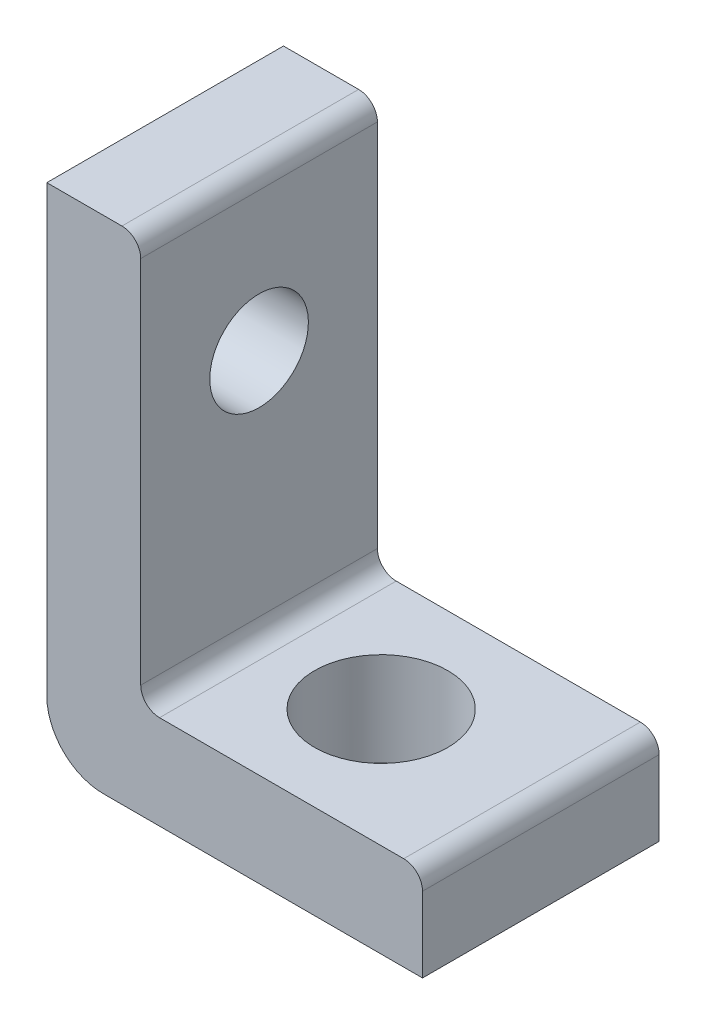
ISO-10303-21;
HEADER;
FILE_DESCRIPTION(('STEP AP214'),'2;1');
FILE_NAME('part.step','',(''),(''),'','','');
FILE_SCHEMA(('AUTOMOTIVE_DESIGN { 1 0 10303 214 1 1 1 1 }'));
ENDSEC;
DATA;
#1=APPLICATION_CONTEXT('core data for automotive mechanical design processes');
#2=APPLICATION_PROTOCOL_DEFINITION('international standard','automotive_design',2000,#1);
#3=PRODUCT_CONTEXT('',#1,'mechanical');
#4=PRODUCT('Part','Part','',(#3));
#5=PRODUCT_RELATED_PRODUCT_CATEGORY('part','',(#4));
#6=PRODUCT_DEFINITION_FORMATION('','',#4);
#7=PRODUCT_DEFINITION_CONTEXT('part definition',#1,'design');
#8=PRODUCT_DEFINITION('design','',#6,#7);
#9=PRODUCT_DEFINITION_SHAPE('','',#8);
#10=(LENGTH_UNIT() NAMED_UNIT(*) SI_UNIT(.MILLI.,.METRE.));
#11=(NAMED_UNIT(*) PLANE_ANGLE_UNIT() SI_UNIT($,.RADIAN.));
#12=(NAMED_UNIT(*) SI_UNIT($,.STERADIAN.) SOLID_ANGLE_UNIT());
#13=UNCERTAINTY_MEASURE_WITH_UNIT(LENGTH_MEASURE(1.E-05),#10,'distance_accuracy_value','');
#14=(GEOMETRIC_REPRESENTATION_CONTEXT(3) GLOBAL_UNCERTAINTY_ASSIGNED_CONTEXT((#13)) GLOBAL_UNIT_ASSIGNED_CONTEXT((#10,
#11,#12)) REPRESENTATION_CONTEXT('',''));
#15=CARTESIAN_POINT('',(0.,0.,0.));
#16=DIRECTION('',(0.,0.,1.));
#17=DIRECTION('',(1.,0.,0.));
#18=AXIS2_PLACEMENT_3D('',#15,#16,#17);
#19=CARTESIAN_POINT('',(4.7625,4.7625,6.));
#20=DIRECTION('',(-1.,0.,0.));
#21=DIRECTION('',(0.,-1.,0.));
#22=AXIS2_PLACEMENT_3D('',#19,#20,#21);
#23=PLANE('',#22);
#24=CARTESIAN_POINT('',(4.7625,17.4,0.));
#25=DIRECTION('',(-1.,0.,0.));
#26=DIRECTION('',(0.,-1.,0.));
#27=AXIS2_PLACEMENT_3D('',#24,#25,#26);
#28=CIRCLE('',#27,2.5);
#29=CARTESIAN_POINT('',(4.7625,14.9,0.));
#30=VERTEX_POINT('',#29);
#31=EDGE_CURVE('E225',#30,#30,#28,.F.);
#32=ORIENTED_EDGE('',*,*,#31,.F.);
#33=EDGE_LOOP('',(#32));
#34=FACE_BOUND('',#33,.T.);
#35=DIRECTION('',(0.,1.,0.));
#36=VECTOR('',#35,1.);
#37=CARTESIAN_POINT('',(4.7625,4.7625,-6.));
#38=LINE('',#37,#36);
#39=CARTESIAN_POINT('',(4.7625,5.715,-6.));
#40=VERTEX_POINT('',#39);
#41=CARTESIAN_POINT('',(4.7625,24.4475,-6.));
#42=VERTEX_POINT('',#41);
#43=EDGE_CURVE('E146',#40,#42,#38,.T.);
#44=ORIENTED_EDGE('',*,*,#43,.T.);
#45=DIRECTION('',(0.,0.,-1.));
#46=VECTOR('',#45,1.);
#47=CARTESIAN_POINT('',(4.7625,24.4475,6.));
#48=LINE('',#47,#46);
#49=CARTESIAN_POINT('',(4.7625,24.4475,6.));
#50=VERTEX_POINT('',#49);
#51=EDGE_CURVE('E181',#42,#50,#48,.F.);
#52=ORIENTED_EDGE('',*,*,#51,.T.);
#53=DIRECTION('',(0.,1.,0.));
#54=VECTOR('',#53,1.);
#55=CARTESIAN_POINT('',(4.7625,4.7625,6.));
#56=LINE('',#55,#54);
#57=CARTESIAN_POINT('',(4.7625,5.715,6.));
#58=VERTEX_POINT('',#57);
#59=EDGE_CURVE('E124',#58,#50,#56,.T.);
#60=ORIENTED_EDGE('',*,*,#59,.F.);
#61=DIRECTION('',(0.,0.,-1.));
#62=VECTOR('',#61,1.);
#63=CARTESIAN_POINT('',(4.7625,5.715,-6.));
#64=LINE('',#63,#62);
#65=EDGE_CURVE('E178',#58,#40,#64,.T.);
#66=ORIENTED_EDGE('',*,*,#65,.T.);
#67=EDGE_LOOP('',(#44,#52,#60,#66));
#68=FACE_BOUND('',#67,.T.);
#69=ADVANCED_FACE('F37',(#34,#68),#23,.F.);
#70=CARTESIAN_POINT('',(4.7625,25.4,6.));
#71=DIRECTION('',(0.,-1.,0.));
#72=DIRECTION('',(0.,0.,-1.));
#73=AXIS2_PLACEMENT_3D('',#70,#71,#72);
#74=PLANE('',#73);
#75=DIRECTION('',(-1.,0.,0.));
#76=VECTOR('',#75,1.);
#77=CARTESIAN_POINT('',(4.7625,25.4,6.));
#78=LINE('',#77,#76);
#79=CARTESIAN_POINT('',(3.81,25.4,6.));
#80=VERTEX_POINT('',#79);
#81=CARTESIAN_POINT('',(0.,25.4,6.));
#82=VERTEX_POINT('',#81);
#83=EDGE_CURVE('E113',#80,#82,#78,.T.);
#84=ORIENTED_EDGE('',*,*,#83,.F.);
#85=DIRECTION('',(0.,0.,-1.));
#86=VECTOR('',#85,1.);
#87=CARTESIAN_POINT('',(3.81,25.4,6.));
#88=LINE('',#87,#86);
#89=CARTESIAN_POINT('',(3.81,25.4,-6.));
#90=VERTEX_POINT('',#89);
#91=EDGE_CURVE('E176',#80,#90,#88,.T.);
#92=ORIENTED_EDGE('',*,*,#91,.T.);
#93=DIRECTION('',(-1.,0.,0.));
#94=VECTOR('',#93,1.);
#95=CARTESIAN_POINT('',(4.7625,25.4,-6.));
#96=LINE('',#95,#94);
#97=CARTESIAN_POINT('',(0.,25.4,-6.));
#98=VERTEX_POINT('',#97);
#99=EDGE_CURVE('E130',#90,#98,#96,.T.);
#100=ORIENTED_EDGE('',*,*,#99,.T.);
#101=DIRECTION('',(0.,0.,-1.));
#102=VECTOR('',#101,1.);
#103=CARTESIAN_POINT('',(0.,25.4,6.));
#104=LINE('',#103,#102);
#105=EDGE_CURVE('E127',#82,#98,#104,.T.);
#106=ORIENTED_EDGE('',*,*,#105,.F.);
#107=EDGE_LOOP('',(#84,#92,#100,#106));
#108=FACE_BOUND('',#107,.T.);
#109=ADVANCED_FACE('F128',(#108),#74,.F.);
#110=CARTESIAN_POINT('',(0.,25.4,6.));
#111=DIRECTION('',(1.,0.,0.));
#112=DIRECTION('',(0.,1.,0.));
#113=AXIS2_PLACEMENT_3D('',#110,#111,#112);
#114=PLANE('',#113);
#115=CARTESIAN_POINT('',(0.,17.4,0.));
#116=DIRECTION('',(-1.,0.,0.));
#117=DIRECTION('',(0.,-1.,0.));
#118=AXIS2_PLACEMENT_3D('',#115,#116,#117);
#119=CIRCLE('',#118,2.5);
#120=CARTESIAN_POINT('',(0.,14.9,0.));
#121=VERTEX_POINT('',#120);
#122=EDGE_CURVE('E228',#121,#121,#119,.T.);
#123=ORIENTED_EDGE('',*,*,#122,.F.);
#124=EDGE_LOOP('',(#123));
#125=FACE_BOUND('',#124,.T.);
#126=DIRECTION('',(0.,-1.,0.));
#127=VECTOR('',#126,1.);
#128=CARTESIAN_POINT('',(0.,25.4,-6.));
#129=LINE('',#128,#127);
#130=CARTESIAN_POINT('',(0.,2.8575,-6.));
#131=VERTEX_POINT('',#130);
#132=EDGE_CURVE('E151',#98,#131,#129,.T.);
#133=ORIENTED_EDGE('',*,*,#132,.T.);
#134=DIRECTION('',(0.,0.,-1.));
#135=VECTOR('',#134,1.);
#136=CARTESIAN_POINT('',(0.,2.8575,6.));
#137=LINE('',#136,#135);
#138=CARTESIAN_POINT('',(0.,2.8575,6.));
#139=VERTEX_POINT('',#138);
#140=EDGE_CURVE('E45',#131,#139,#137,.F.);
#141=ORIENTED_EDGE('',*,*,#140,.T.);
#142=DIRECTION('',(0.,-1.,0.));
#143=VECTOR('',#142,1.);
#144=CARTESIAN_POINT('',(0.,25.4,6.));
#145=LINE('',#144,#143);
#146=EDGE_CURVE('E116',#82,#139,#145,.T.);
#147=ORIENTED_EDGE('',*,*,#146,.F.);
#148=ORIENTED_EDGE('',*,*,#105,.T.);
#149=EDGE_LOOP('',(#133,#141,#147,#148));
#150=FACE_BOUND('',#149,.T.);
#151=ADVANCED_FACE('F134',(#125,#150),#114,.F.);
#152=CARTESIAN_POINT('',(0.,0.,6.));
#153=DIRECTION('',(0.,1.,0.));
#154=DIRECTION('',(0.,0.,1.));
#155=AXIS2_PLACEMENT_3D('',#152,#153,#154);
#156=PLANE('',#155);
#157=CARTESIAN_POINT('',(10.95375,0.,0.));
#158=DIRECTION('',(0.,-1.,0.));
#159=DIRECTION('',(0.,0.,-1.));
#160=AXIS2_PLACEMENT_3D('',#157,#158,#159);
#161=CIRCLE('',#160,3.37819999999999);
#162=CARTESIAN_POINT('',(10.95375,0.,-3.37819999999999));
#163=VERTEX_POINT('',#162);
#164=EDGE_CURVE('E222',#163,#163,#161,.T.);
#165=ORIENTED_EDGE('',*,*,#164,.F.);
#166=EDGE_LOOP('',(#165));
#167=FACE_BOUND('',#166,.T.);
#168=DIRECTION('',(1.,0.,0.));
#169=VECTOR('',#168,1.);
#170=CARTESIAN_POINT('',(0.,0.,6.));
#171=LINE('',#170,#169);
#172=CARTESIAN_POINT('',(2.8575,0.,6.));
#173=VERTEX_POINT('',#172);
#174=CARTESIAN_POINT('',(19.05,0.,6.));
#175=VERTEX_POINT('',#174);
#176=EDGE_CURVE('E135',#173,#175,#171,.T.);
#177=ORIENTED_EDGE('',*,*,#176,.F.);
#178=DIRECTION('',(0.,0.,-1.));
#179=VECTOR('',#178,1.);
#180=CARTESIAN_POINT('',(2.8575,0.,6.));
#181=LINE('',#180,#179);
#182=CARTESIAN_POINT('',(2.8575,0.,-6.));
#183=VERTEX_POINT('',#182);
#184=EDGE_CURVE('E187',#173,#183,#181,.T.);
#185=ORIENTED_EDGE('',*,*,#184,.T.);
#186=DIRECTION('',(1.,0.,0.));
#187=VECTOR('',#186,1.);
#188=CARTESIAN_POINT('',(0.,0.,-6.));
#189=LINE('',#188,#187);
#190=CARTESIAN_POINT('',(19.05,0.,-6.));
#191=VERTEX_POINT('',#190);
#192=EDGE_CURVE('E153',#183,#191,#189,.T.);
#193=ORIENTED_EDGE('',*,*,#192,.T.);
#194=DIRECTION('',(0.,0.,-1.));
#195=VECTOR('',#194,1.);
#196=CARTESIAN_POINT('',(19.05,0.,6.));
#197=LINE('',#196,#195);
#198=EDGE_CURVE('E132',#175,#191,#197,.T.);
#199=ORIENTED_EDGE('',*,*,#198,.F.);
#200=EDGE_LOOP('',(#177,#185,#193,#199));
#201=FACE_BOUND('',#200,.T.);
#202=ADVANCED_FACE('F193',(#167,#201),#156,.F.);
#203=CARTESIAN_POINT('',(19.05,0.,6.));
#204=DIRECTION('',(-1.,0.,0.));
#205=DIRECTION('',(0.,0.,1.));
#206=AXIS2_PLACEMENT_3D('',#203,#204,#205);
#207=PLANE('',#206);
#208=DIRECTION('',(0.,1.,0.));
#209=VECTOR('',#208,1.);
#210=CARTESIAN_POINT('',(19.05,0.,-6.));
#211=LINE('',#210,#209);
#212=CARTESIAN_POINT('',(19.05,3.81,-6.));
#213=VERTEX_POINT('',#212);
#214=EDGE_CURVE('E155',#191,#213,#211,.T.);
#215=ORIENTED_EDGE('',*,*,#214,.T.);
#216=DIRECTION('',(0.,0.,-1.));
#217=VECTOR('',#216,1.);
#218=CARTESIAN_POINT('',(19.05,3.81,6.));
#219=LINE('',#218,#217);
#220=CARTESIAN_POINT('',(19.05,3.81,6.));
#221=VERTEX_POINT('',#220);
#222=EDGE_CURVE('E171',#213,#221,#219,.F.);
#223=ORIENTED_EDGE('',*,*,#222,.T.);
#224=DIRECTION('',(0.,1.,0.));
#225=VECTOR('',#224,1.);
#226=CARTESIAN_POINT('',(19.05,0.,6.));
#227=LINE('',#226,#225);
#228=EDGE_CURVE('E137',#175,#221,#227,.T.);
#229=ORIENTED_EDGE('',*,*,#228,.F.);
#230=ORIENTED_EDGE('',*,*,#198,.T.);
#231=EDGE_LOOP('',(#215,#223,#229,#230));
#232=FACE_BOUND('',#231,.T.);
#233=ADVANCED_FACE('F201',(#232),#207,.F.);
#234=CARTESIAN_POINT('',(19.05,4.7625,6.));
#235=DIRECTION('',(0.,-1.,0.));
#236=DIRECTION('',(1.,0.,0.));
#237=AXIS2_PLACEMENT_3D('',#234,#235,#236);
#238=PLANE('',#237);
#239=CARTESIAN_POINT('',(10.95375,4.7625,0.));
#240=DIRECTION('',(0.,-1.,0.));
#241=DIRECTION('',(1.,0.,0.));
#242=AXIS2_PLACEMENT_3D('',#239,#240,#241);
#243=CIRCLE('',#242,3.37819999999999);
#244=CARTESIAN_POINT('',(14.33195,4.7625,0.));
#245=VERTEX_POINT('',#244);
#246=EDGE_CURVE('E149',#245,#245,#243,.T.);
#247=ORIENTED_EDGE('',*,*,#246,.T.);
#248=EDGE_LOOP('',(#247));
#249=FACE_BOUND('',#248,.T.);
#250=DIRECTION('',(-1.,0.,0.));
#251=VECTOR('',#250,1.);
#252=CARTESIAN_POINT('',(19.05,4.7625,6.));
#253=LINE('',#252,#251);
#254=CARTESIAN_POINT('',(18.0975,4.7625,6.));
#255=VERTEX_POINT('',#254);
#256=CARTESIAN_POINT('',(5.715,4.7625,6.));
#257=VERTEX_POINT('',#256);
#258=EDGE_CURVE('E143',#255,#257,#253,.T.);
#259=ORIENTED_EDGE('',*,*,#258,.F.);
#260=DIRECTION('',(0.,0.,-1.));
#261=VECTOR('',#260,1.);
#262=CARTESIAN_POINT('',(18.0975,4.7625,6.));
#263=LINE('',#262,#261);
#264=CARTESIAN_POINT('',(18.0975,4.7625,-6.));
#265=VERTEX_POINT('',#264);
#266=EDGE_CURVE('E164',#255,#265,#263,.T.);
#267=ORIENTED_EDGE('',*,*,#266,.T.);
#268=DIRECTION('',(-1.,0.,0.));
#269=VECTOR('',#268,1.);
#270=CARTESIAN_POINT('',(19.05,4.7625,-6.));
#271=LINE('',#270,#269);
#272=CARTESIAN_POINT('',(5.715,4.7625,-6.));
#273=VERTEX_POINT('',#272);
#274=EDGE_CURVE('E158',#265,#273,#271,.T.);
#275=ORIENTED_EDGE('',*,*,#274,.T.);
#276=DIRECTION('',(0.,0.,-1.));
#277=VECTOR('',#276,1.);
#278=CARTESIAN_POINT('',(5.715,4.7625,6.));
#279=LINE('',#278,#277);
#280=EDGE_CURVE('E131',#273,#257,#279,.F.);
#281=ORIENTED_EDGE('',*,*,#280,.T.);
#282=EDGE_LOOP('',(#259,#267,#275,#281));
#283=FACE_BOUND('',#282,.T.);
#284=ADVANCED_FACE('F210',(#249,#283),#238,.F.);
#285=CARTESIAN_POINT('',(0.,0.,6.));
#286=DIRECTION('',(0.,0.,1.));
#287=DIRECTION('',(1.,0.,0.));
#288=AXIS2_PLACEMENT_3D('',#285,#286,#287);
#289=PLANE('',#288);
#290=ORIENTED_EDGE('',*,*,#146,.T.);
#291=CARTESIAN_POINT('',(2.8575,2.8575,6.));
#292=DIRECTION('',(0.,0.,1.));
#293=DIRECTION('',(1.,0.,0.));
#294=AXIS2_PLACEMENT_3D('',#291,#292,#293);
#295=CIRCLE('',#294,2.8575);
#296=EDGE_CURVE('E11',#139,#173,#295,.T.);
#297=ORIENTED_EDGE('',*,*,#296,.T.);
#298=ORIENTED_EDGE('',*,*,#176,.T.);
#299=ORIENTED_EDGE('',*,*,#228,.T.);
#300=CARTESIAN_POINT('',(18.0975,3.81,6.));
#301=DIRECTION('',(0.,0.,1.));
#302=DIRECTION('',(1.,0.,0.));
#303=AXIS2_PLACEMENT_3D('',#300,#301,#302);
#304=CIRCLE('',#303,0.9525);
#305=EDGE_CURVE('E174',#221,#255,#304,.T.);
#306=ORIENTED_EDGE('',*,*,#305,.T.);
#307=ORIENTED_EDGE('',*,*,#258,.T.);
#308=CARTESIAN_POINT('',(5.715,5.715,6.));
#309=DIRECTION('',(0.,0.,1.));
#310=DIRECTION('',(1.,0.,0.));
#311=AXIS2_PLACEMENT_3D('',#308,#309,#310);
#312=CIRCLE('',#311,0.9525);
#313=EDGE_CURVE('E185',#257,#58,#312,.F.);
#314=ORIENTED_EDGE('',*,*,#313,.T.);
#315=ORIENTED_EDGE('',*,*,#59,.T.);
#316=CARTESIAN_POINT('',(3.81,24.4475,6.));
#317=DIRECTION('',(0.,0.,1.));
#318=DIRECTION('',(1.,0.,0.));
#319=AXIS2_PLACEMENT_3D('',#316,#317,#318);
#320=CIRCLE('',#319,0.9525);
#321=EDGE_CURVE('E120',#50,#80,#320,.T.);
#322=ORIENTED_EDGE('',*,*,#321,.T.);
#323=ORIENTED_EDGE('',*,*,#83,.T.);
#324=EDGE_LOOP('',(#290,#297,#298,#299,#306,#307,#314,#315,#322,#323));
#325=FACE_BOUND('',#324,.T.);
#326=ADVANCED_FACE('F115',(#325),#289,.T.);
#327=CARTESIAN_POINT('',(0.,0.,-6.));
#328=DIRECTION('',(0.,0.,1.));
#329=DIRECTION('',(1.,0.,0.));
#330=AXIS2_PLACEMENT_3D('',#327,#328,#329);
#331=PLANE('',#330);
#332=ORIENTED_EDGE('',*,*,#192,.F.);
#333=CARTESIAN_POINT('',(2.8575,2.8575,-6.));
#334=DIRECTION('',(0.,0.,1.));
#335=DIRECTION('',(1.,0.,0.));
#336=AXIS2_PLACEMENT_3D('',#333,#334,#335);
#337=CIRCLE('',#336,2.8575);
#338=EDGE_CURVE('E59',#183,#131,#337,.F.);
#339=ORIENTED_EDGE('',*,*,#338,.T.);
#340=ORIENTED_EDGE('',*,*,#132,.F.);
#341=ORIENTED_EDGE('',*,*,#99,.F.);
#342=CARTESIAN_POINT('',(3.81,24.4475,-6.));
#343=DIRECTION('',(0.,0.,1.));
#344=DIRECTION('',(1.,0.,0.));
#345=AXIS2_PLACEMENT_3D('',#342,#343,#344);
#346=CIRCLE('',#345,0.9525);
#347=EDGE_CURVE('E167',#90,#42,#346,.F.);
#348=ORIENTED_EDGE('',*,*,#347,.T.);
#349=ORIENTED_EDGE('',*,*,#43,.F.);
#350=CARTESIAN_POINT('',(5.715,5.715,-6.));
#351=DIRECTION('',(0.,0.,1.));
#352=DIRECTION('',(1.,0.,0.));
#353=AXIS2_PLACEMENT_3D('',#350,#351,#352);
#354=CIRCLE('',#353,0.9525);
#355=EDGE_CURVE('E183',#40,#273,#354,.T.);
#356=ORIENTED_EDGE('',*,*,#355,.T.);
#357=ORIENTED_EDGE('',*,*,#274,.F.);
#358=CARTESIAN_POINT('',(18.0975,3.81,-6.));
#359=DIRECTION('',(0.,0.,1.));
#360=DIRECTION('',(1.,0.,0.));
#361=AXIS2_PLACEMENT_3D('',#358,#359,#360);
#362=CIRCLE('',#361,0.9525);
#363=EDGE_CURVE('E169',#265,#213,#362,.F.);
#364=ORIENTED_EDGE('',*,*,#363,.T.);
#365=ORIENTED_EDGE('',*,*,#214,.F.);
#366=EDGE_LOOP('',(#332,#339,#340,#341,#348,#349,#356,#357,#364,#365));
#367=FACE_BOUND('',#366,.T.);
#368=ADVANCED_FACE('F197',(#367),#331,.F.);
#369=CARTESIAN_POINT('',(18.0975,3.81,6.));
#370=DIRECTION('',(0.,0.,-1.));
#371=DIRECTION('',(-1.,0.,0.));
#372=AXIS2_PLACEMENT_3D('',#369,#370,#371);
#373=CYLINDRICAL_SURFACE('',#372,0.9525);
#374=ORIENTED_EDGE('',*,*,#305,.F.);
#375=ORIENTED_EDGE('',*,*,#222,.F.);
#376=ORIENTED_EDGE('',*,*,#363,.F.);
#377=ORIENTED_EDGE('',*,*,#266,.F.);
#378=EDGE_LOOP('',(#374,#375,#376,#377));
#379=FACE_BOUND('',#378,.T.);
#380=ADVANCED_FACE('F205',(#379),#373,.T.);
#381=CARTESIAN_POINT('',(3.81,24.4475,6.));
#382=DIRECTION('',(0.,0.,-1.));
#383=DIRECTION('',(-1.,0.,0.));
#384=AXIS2_PLACEMENT_3D('',#381,#382,#383);
#385=CYLINDRICAL_SURFACE('',#384,0.9525);
#386=ORIENTED_EDGE('',*,*,#321,.F.);
#387=ORIENTED_EDGE('',*,*,#51,.F.);
#388=ORIENTED_EDGE('',*,*,#347,.F.);
#389=ORIENTED_EDGE('',*,*,#91,.F.);
#390=EDGE_LOOP('',(#386,#387,#388,#389));
#391=FACE_BOUND('',#390,.T.);
#392=ADVANCED_FACE('F255',(#391),#385,.T.);
#393=CARTESIAN_POINT('',(5.715,5.715,6.));
#394=DIRECTION('',(0.,0.,1.));
#395=DIRECTION('',(1.,0.,0.));
#396=AXIS2_PLACEMENT_3D('',#393,#394,#395);
#397=CYLINDRICAL_SURFACE('',#396,0.9525);
#398=ORIENTED_EDGE('',*,*,#313,.F.);
#399=ORIENTED_EDGE('',*,*,#280,.F.);
#400=ORIENTED_EDGE('',*,*,#355,.F.);
#401=ORIENTED_EDGE('',*,*,#65,.F.);
#402=EDGE_LOOP('',(#398,#399,#400,#401));
#403=FACE_BOUND('',#402,.T.);
#404=ADVANCED_FACE('F213',(#403),#397,.F.);
#405=CARTESIAN_POINT('',(2.8575,2.8575,6.));
#406=DIRECTION('',(0.,0.,-1.));
#407=DIRECTION('',(-1.,0.,0.));
#408=AXIS2_PLACEMENT_3D('',#405,#406,#407);
#409=CYLINDRICAL_SURFACE('',#408,2.8575);
#410=ORIENTED_EDGE('',*,*,#296,.F.);
#411=ORIENTED_EDGE('',*,*,#140,.F.);
#412=ORIENTED_EDGE('',*,*,#338,.F.);
#413=ORIENTED_EDGE('',*,*,#184,.F.);
#414=EDGE_LOOP('',(#410,#411,#412,#413));
#415=FACE_BOUND('',#414,.T.);
#416=ADVANCED_FACE('F39',(#415),#409,.T.);
#417=CARTESIAN_POINT('',(10.95375,0.,0.));
#418=DIRECTION('',(0.,-1.,0.));
#419=DIRECTION('',(0.,0.,-1.));
#420=AXIS2_PLACEMENT_3D('',#417,#418,#419);
#421=CYLINDRICAL_SURFACE('',#420,3.37819999999999);
#422=ORIENTED_EDGE('',*,*,#164,.T.);
#423=EDGE_LOOP('',(#422));
#424=FACE_BOUND('',#423,.T.);
#425=ORIENTED_EDGE('',*,*,#246,.F.);
#426=EDGE_LOOP('',(#425));
#427=FACE_BOUND('',#426,.T.);
#428=ADVANCED_FACE('F262',(#424,#427),#421,.F.);
#429=CARTESIAN_POINT('',(19.051,17.4,0.));
#430=DIRECTION('',(-1.,0.,0.));
#431=DIRECTION('',(0.,-1.,0.));
#432=AXIS2_PLACEMENT_3D('',#429,#430,#431);
#433=CYLINDRICAL_SURFACE('',#432,2.5);
#434=ORIENTED_EDGE('',*,*,#122,.T.);
#435=EDGE_LOOP('',(#434));
#436=FACE_BOUND('',#435,.T.);
#437=ORIENTED_EDGE('',*,*,#31,.T.);
#438=EDGE_LOOP('',(#437));
#439=FACE_BOUND('',#438,.T.);
#440=ADVANCED_FACE('F232',(#436,#439),#433,.F.);
#441=CLOSED_SHELL('',(#69,#109,#151,#202,#233,#284,#326,#368,#380,#392,#404,#416,#428,#440));
#442=MANIFOLD_SOLID_BREP('B2',#441);
#443=ADVANCED_BREP_SHAPE_REPRESENTATION('',(#18,#442),#14);
#444=SHAPE_DEFINITION_REPRESENTATION(#9,#443);
ENDSEC;
END-ISO-10303-21;
